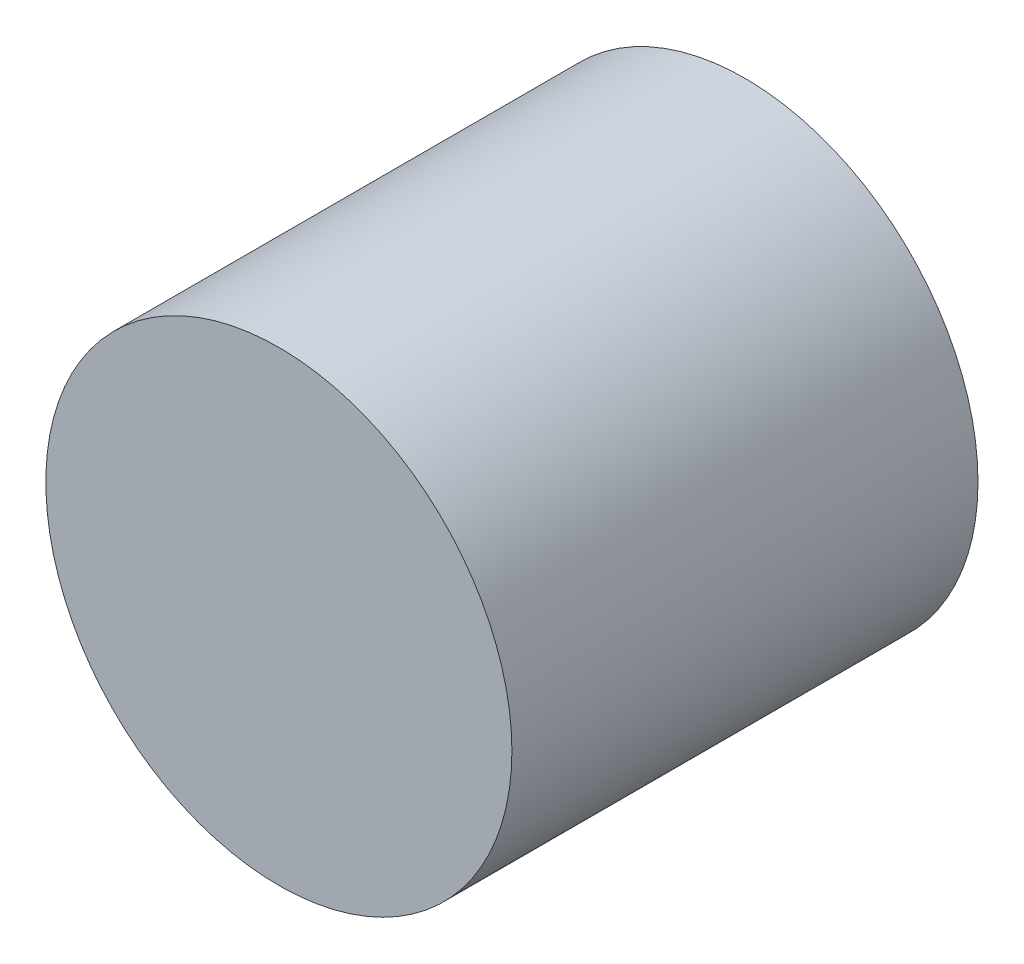
ISO-10303-21;
HEADER;
FILE_DESCRIPTION(('STEP AP214'),'2;1');
FILE_NAME('part.step','',(''),(''),'','','');
FILE_SCHEMA(('AUTOMOTIVE_DESIGN { 1 0 10303 214 1 1 1 1 }'));
ENDSEC;
DATA;
#1=APPLICATION_CONTEXT('core data for automotive mechanical design processes');
#2=APPLICATION_PROTOCOL_DEFINITION('international standard','automotive_design',2000,#1);
#3=PRODUCT_CONTEXT('',#1,'mechanical');
#4=PRODUCT('Part','Part','',(#3));
#5=PRODUCT_RELATED_PRODUCT_CATEGORY('part','',(#4));
#6=PRODUCT_DEFINITION_FORMATION('','',#4);
#7=PRODUCT_DEFINITION_CONTEXT('part definition',#1,'design');
#8=PRODUCT_DEFINITION('design','',#6,#7);
#9=PRODUCT_DEFINITION_SHAPE('','',#8);
#10=(LENGTH_UNIT() NAMED_UNIT(*) SI_UNIT(.MILLI.,.METRE.));
#11=(NAMED_UNIT(*) PLANE_ANGLE_UNIT() SI_UNIT($,.RADIAN.));
#12=(NAMED_UNIT(*) SI_UNIT($,.STERADIAN.) SOLID_ANGLE_UNIT());
#13=UNCERTAINTY_MEASURE_WITH_UNIT(LENGTH_MEASURE(1.E-05),#10,'distance_accuracy_value','');
#14=(GEOMETRIC_REPRESENTATION_CONTEXT(3) GLOBAL_UNCERTAINTY_ASSIGNED_CONTEXT((#13)) GLOBAL_UNIT_ASSIGNED_CONTEXT((#10,
#11,#12)) REPRESENTATION_CONTEXT('',''));
#15=CARTESIAN_POINT('',(0.,0.,0.));
#16=DIRECTION('',(0.,0.,1.));
#17=DIRECTION('',(1.,0.,0.));
#18=AXIS2_PLACEMENT_3D('',#15,#16,#17);
#19=CARTESIAN_POINT('',(0.,0.,3.));
#20=DIRECTION('',(0.,0.,-1.));
#21=DIRECTION('',(-1.,0.,0.));
#22=AXIS2_PLACEMENT_3D('',#19,#20,#21);
#23=CYLINDRICAL_SURFACE('',#22,1.5);
#24=CARTESIAN_POINT('',(0.,0.,3.));
#25=DIRECTION('',(0.,0.,1.));
#26=DIRECTION('',(1.,0.,0.));
#27=AXIS2_PLACEMENT_3D('',#24,#25,#26);
#28=CIRCLE('',#27,1.5);
#29=CARTESIAN_POINT('',(1.5,0.,3.));
#30=VERTEX_POINT('',#29);
#31=EDGE_CURVE('E10',#30,#30,#28,.T.);
#32=ORIENTED_EDGE('',*,*,#31,.F.);
#33=EDGE_LOOP('',(#32));
#34=FACE_BOUND('',#33,.T.);
#35=CARTESIAN_POINT('',(0.,0.,0.));
#36=DIRECTION('',(0.,0.,1.));
#37=DIRECTION('',(1.,0.,0.));
#38=AXIS2_PLACEMENT_3D('',#35,#36,#37);
#39=CIRCLE('',#38,1.5);
#40=CARTESIAN_POINT('',(1.5,0.,0.));
#41=VERTEX_POINT('',#40);
#42=EDGE_CURVE('E45',#41,#41,#39,.T.);
#43=ORIENTED_EDGE('',*,*,#42,.T.);
#44=EDGE_LOOP('',(#43));
#45=FACE_BOUND('',#44,.T.);
#46=ADVANCED_FACE('F39',(#34,#45),#23,.T.);
#47=CARTESIAN_POINT('',(0.,0.,3.));
#48=DIRECTION('',(0.,0.,1.));
#49=DIRECTION('',(1.,0.,0.));
#50=AXIS2_PLACEMENT_3D('',#47,#48,#49);
#51=PLANE('',#50);
#52=ORIENTED_EDGE('',*,*,#31,.T.);
#53=EDGE_LOOP('',(#52));
#54=FACE_BOUND('',#53,.T.);
#55=ADVANCED_FACE('F53',(#54),#51,.T.);
#56=CARTESIAN_POINT('',(0.,0.,0.));
#57=DIRECTION('',(0.,0.,1.));
#58=DIRECTION('',(1.,0.,0.));
#59=AXIS2_PLACEMENT_3D('',#56,#57,#58);
#60=PLANE('',#59);
#61=ORIENTED_EDGE('',*,*,#42,.F.);
#62=EDGE_LOOP('',(#61));
#63=FACE_BOUND('',#62,.T.);
#64=ADVANCED_FACE('F55',(#63),#60,.F.);
#65=CLOSED_SHELL('',(#46,#55,#64));
#66=MANIFOLD_SOLID_BREP('B2',#65);
#67=ADVANCED_BREP_SHAPE_REPRESENTATION('',(#18,#66),#14);
#68=SHAPE_DEFINITION_REPRESENTATION(#9,#67);
ENDSEC;
END-ISO-10303-21;
